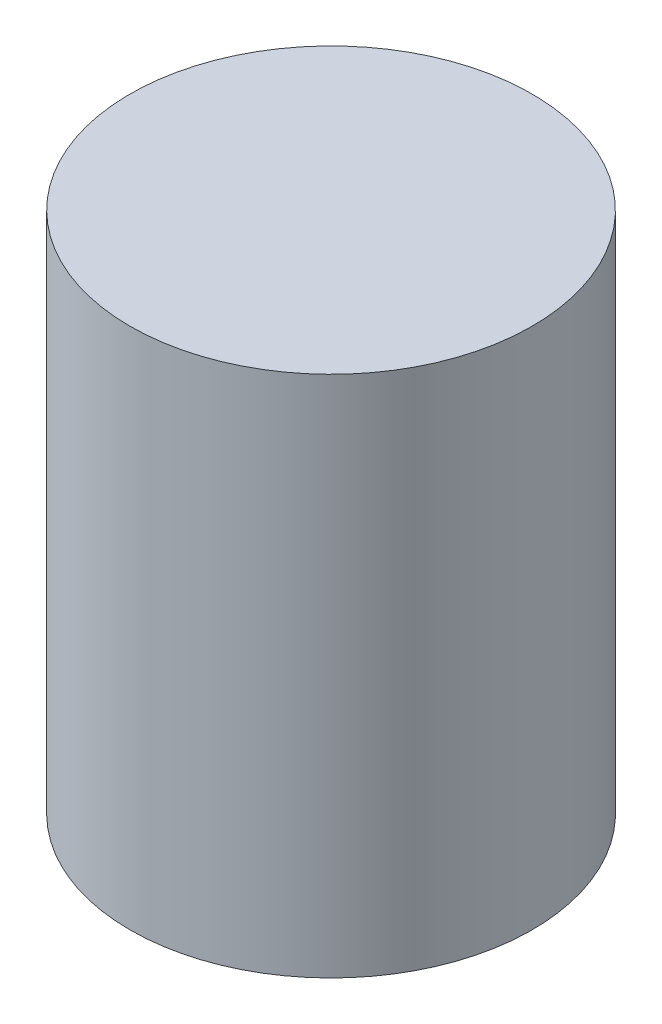
ISO-10303-21;
HEADER;
FILE_DESCRIPTION(('STEP AP214'),'2;1');
FILE_NAME('part.step','',(''),(''),'','','');
FILE_SCHEMA(('AUTOMOTIVE_DESIGN { 1 0 10303 214 1 1 1 1 }'));
ENDSEC;
DATA;
#1=APPLICATION_CONTEXT('core data for automotive mechanical design processes');
#2=APPLICATION_PROTOCOL_DEFINITION('international standard','automotive_design',2000,#1);
#3=PRODUCT_CONTEXT('',#1,'mechanical');
#4=PRODUCT('Part','Part','',(#3));
#5=PRODUCT_RELATED_PRODUCT_CATEGORY('part','',(#4));
#6=PRODUCT_DEFINITION_FORMATION('','',#4);
#7=PRODUCT_DEFINITION_CONTEXT('part definition',#1,'design');
#8=PRODUCT_DEFINITION('design','',#6,#7);
#9=PRODUCT_DEFINITION_SHAPE('','',#8);
#10=(LENGTH_UNIT() NAMED_UNIT(*) SI_UNIT(.MILLI.,.METRE.));
#11=(NAMED_UNIT(*) PLANE_ANGLE_UNIT() SI_UNIT($,.RADIAN.));
#12=(NAMED_UNIT(*) SI_UNIT($,.STERADIAN.) SOLID_ANGLE_UNIT());
#13=UNCERTAINTY_MEASURE_WITH_UNIT(LENGTH_MEASURE(1.E-05),#10,'distance_accuracy_value','');
#14=(GEOMETRIC_REPRESENTATION_CONTEXT(3) GLOBAL_UNCERTAINTY_ASSIGNED_CONTEXT((#13)) GLOBAL_UNIT_ASSIGNED_CONTEXT((#10,
#11,#12)) REPRESENTATION_CONTEXT('',''));
#15=CARTESIAN_POINT('',(0.,0.,0.));
#16=DIRECTION('',(0.,0.,1.));
#17=DIRECTION('',(1.,0.,0.));
#18=AXIS2_PLACEMENT_3D('',#15,#16,#17);
#19=CARTESIAN_POINT('',(0.,32.5,0.));
#20=DIRECTION('',(0.,-1.,0.));
#21=DIRECTION('',(0.,0.,-1.));
#22=AXIS2_PLACEMENT_3D('',#19,#20,#21);
#23=CYLINDRICAL_SURFACE('',#22,12.5);
#24=CARTESIAN_POINT('',(0.,32.5,0.));
#25=DIRECTION('',(0.,1.,0.));
#26=DIRECTION('',(0.,0.,1.));
#27=AXIS2_PLACEMENT_3D('',#24,#25,#26);
#28=CIRCLE('',#27,12.5);
#29=CARTESIAN_POINT('',(0.,32.5,12.5));
#30=VERTEX_POINT('',#29);
#31=EDGE_CURVE('E10',#30,#30,#28,.T.);
#32=ORIENTED_EDGE('',*,*,#31,.F.);
#33=EDGE_LOOP('',(#32));
#34=FACE_BOUND('',#33,.T.);
#35=CARTESIAN_POINT('',(0.,0.,0.));
#36=DIRECTION('',(0.,1.,0.));
#37=DIRECTION('',(0.,0.,1.));
#38=AXIS2_PLACEMENT_3D('',#35,#36,#37);
#39=CIRCLE('',#38,12.5);
#40=CARTESIAN_POINT('',(0.,0.,12.5));
#41=VERTEX_POINT('',#40);
#42=EDGE_CURVE('E40',#41,#41,#39,.T.);
#43=ORIENTED_EDGE('',*,*,#42,.T.);
#44=EDGE_LOOP('',(#43));
#45=FACE_BOUND('',#44,.T.);
#46=ADVANCED_FACE('F37',(#34,#45),#23,.T.);
#47=CARTESIAN_POINT('',(0.,32.5,0.));
#48=DIRECTION('',(0.,1.,0.));
#49=DIRECTION('',(0.,0.,1.));
#50=AXIS2_PLACEMENT_3D('',#47,#48,#49);
#51=PLANE('',#50);
#52=ORIENTED_EDGE('',*,*,#31,.T.);
#53=EDGE_LOOP('',(#52));
#54=FACE_BOUND('',#53,.T.);
#55=ADVANCED_FACE('F54',(#54),#51,.T.);
#56=CARTESIAN_POINT('',(0.,0.,0.));
#57=DIRECTION('',(0.,1.,0.));
#58=DIRECTION('',(0.,0.,1.));
#59=AXIS2_PLACEMENT_3D('',#56,#57,#58);
#60=PLANE('',#59);
#61=ORIENTED_EDGE('',*,*,#42,.F.);
#62=EDGE_LOOP('',(#61));
#63=FACE_BOUND('',#62,.T.);
#64=ADVANCED_FACE('F52',(#63),#60,.F.);
#65=CLOSED_SHELL('',(#46,#55,#64));
#66=MANIFOLD_SOLID_BREP('B2',#65);
#67=ADVANCED_BREP_SHAPE_REPRESENTATION('',(#18,#66),#14);
#68=SHAPE_DEFINITION_REPRESENTATION(#9,#67);
ENDSEC;
END-ISO-10303-21;
